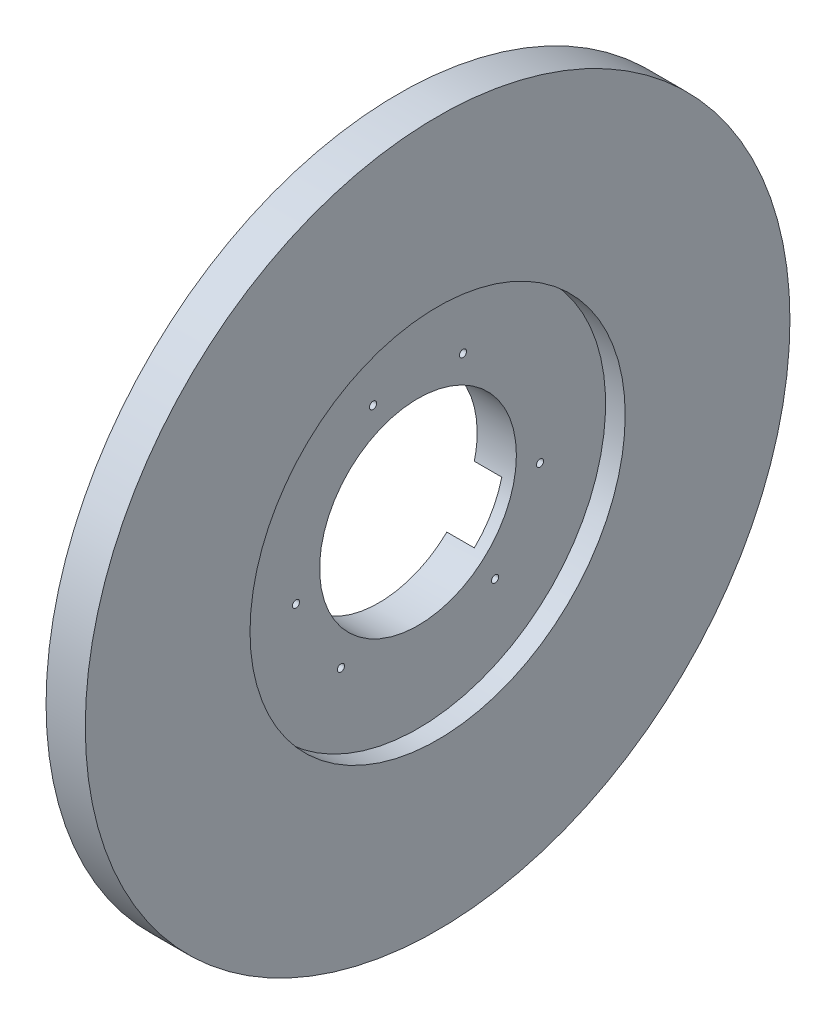
ISO-10303-21;
HEADER;
FILE_DESCRIPTION(('STEP AP214'),'2;1');
FILE_NAME('part.step','',(''),(''),'','','');
FILE_SCHEMA(('AUTOMOTIVE_DESIGN { 1 0 10303 214 1 1 1 1 }'));
ENDSEC;
DATA;
#1=APPLICATION_CONTEXT('core data for automotive mechanical design processes');
#2=APPLICATION_PROTOCOL_DEFINITION('international standard','automotive_design',2000,#1);
#3=PRODUCT_CONTEXT('',#1,'mechanical');
#4=PRODUCT('Part','Part','',(#3));
#5=PRODUCT_RELATED_PRODUCT_CATEGORY('part','',(#4));
#6=PRODUCT_DEFINITION_FORMATION('','',#4);
#7=PRODUCT_DEFINITION_CONTEXT('part definition',#1,'design');
#8=PRODUCT_DEFINITION('design','',#6,#7);
#9=PRODUCT_DEFINITION_SHAPE('','',#8);
#10=(LENGTH_UNIT() NAMED_UNIT(*) SI_UNIT(.MILLI.,.METRE.));
#11=(NAMED_UNIT(*) PLANE_ANGLE_UNIT() SI_UNIT($,.RADIAN.));
#12=(NAMED_UNIT(*) SI_UNIT($,.STERADIAN.) SOLID_ANGLE_UNIT());
#13=UNCERTAINTY_MEASURE_WITH_UNIT(LENGTH_MEASURE(1.E-05),#10,'distance_accuracy_value','');
#14=(GEOMETRIC_REPRESENTATION_CONTEXT(3) GLOBAL_UNCERTAINTY_ASSIGNED_CONTEXT((#13)) GLOBAL_UNIT_ASSIGNED_CONTEXT((#10,
#11,#12)) REPRESENTATION_CONTEXT('',''));
#15=CARTESIAN_POINT('',(0.,0.,0.));
#16=DIRECTION('',(0.,0.,1.));
#17=DIRECTION('',(1.,0.,0.));
#18=AXIS2_PLACEMENT_3D('',#15,#16,#17);
#19=CARTESIAN_POINT('',(-5.,0.,0.));
#20=DIRECTION('',(-1.,0.,0.));
#21=DIRECTION('',(0.,0.,1.));
#22=AXIS2_PLACEMENT_3D('',#19,#20,#21);
#23=PLANE('',#22);
#24=CARTESIAN_POINT('',(-5.,0.,0.));
#25=DIRECTION('',(1.,0.,0.));
#26=DIRECTION('',(0.,0.,-1.));
#27=AXIS2_PLACEMENT_3D('',#24,#25,#26);
#28=CIRCLE('',#27,25.085);
#29=CARTESIAN_POINT('',(-5.,-5.97828167242084,-24.3622119940944));
#30=VERTEX_POINT('',#29);
#31=CARTESIAN_POINT('',(-5.,24.0874353154781,-7.00376219775181));
#32=VERTEX_POINT('',#31);
#33=EDGE_CURVE('E238',#30,#32,#28,.T.);
#34=ORIENTED_EDGE('',*,*,#33,.T.);
#35=CARTESIAN_POINT('',(-5.,29.2826,0.));
#36=DIRECTION('',(1.,0.,0.));
#37=DIRECTION('',(0.,0.,1.));
#38=AXIS2_PLACEMENT_3D('',#35,#36,#37);
#39=CIRCLE('',#38,8.72023056013776);
#40=CARTESIAN_POINT('',(-5.,29.2826,-8.72023056013776));
#41=VERTEX_POINT('',#40);
#42=EDGE_CURVE('E61',#32,#41,#39,.T.);
#43=ORIENTED_EDGE('',*,*,#42,.T.);
#44=CARTESIAN_POINT('',(-5.,29.2826,-11.4641016151378));
#45=DIRECTION('',(-1.,0.,0.));
#46=DIRECTION('',(0.,0.,-1.));
#47=AXIS2_PLACEMENT_3D('',#44,#45,#46);
#48=CIRCLE('',#47,2.743871055);
#49=CARTESIAN_POINT('',(-5.,30.6545355275,-13.8403636534766));
#50=VERTEX_POINT('',#49);
#51=EDGE_CURVE('E170',#41,#50,#48,.T.);
#52=ORIENTED_EDGE('',*,*,#51,.T.);
#53=DIRECTION('',(0.,-0.866025403784439,-0.5));
#54=VECTOR('',#53,1.);
#55=CARTESIAN_POINT('',(-5.,-3.34116124222451,-33.4677883347659));
#56=LINE('',#55,#54);
#57=CARTESIAN_POINT('',(-5.,-3.34116124222451,-33.4677883347659));
#58=VERTEX_POINT('',#57);
#59=EDGE_CURVE('E259',#50,#58,#56,.T.);
#60=ORIENTED_EDGE('',*,*,#59,.T.);
#61=CARTESIAN_POINT('',(-5.,-4.71309676972448,-31.0915262964271));
#62=DIRECTION('',(-1.,0.,0.));
#63=DIRECTION('',(0.,0.,1.));
#64=AXIS2_PLACEMENT_3D('',#61,#62,#63);
#65=CIRCLE('',#64,2.74387105500001);
#66=CARTESIAN_POINT('',(-5.,-7.08935880806329,-29.7195907689271));
#67=VERTEX_POINT('',#66);
#68=EDGE_CURVE('E262',#58,#67,#65,.T.);
#69=ORIENTED_EDGE('',*,*,#68,.T.);
#70=CARTESIAN_POINT('',(-5.,-14.6413,-25.3594754888582));
#71=DIRECTION('',(1.,0.,0.));
#72=DIRECTION('',(0.,0.,1.));
#73=AXIS2_PLACEMENT_3D('',#70,#71,#72);
#74=CIRCLE('',#73,8.72023056013776);
#75=EDGE_CURVE('E266',#67,#30,#74,.T.);
#76=ORIENTED_EDGE('',*,*,#75,.T.);
#77=EDGE_LOOP('',(#34,#43,#52,#60,#69,#76));
#78=FACE_BOUND('',#77,.T.);
#79=CARTESIAN_POINT('',(-5.,-4.74524992630389,-31.1100899300334));
#80=DIRECTION('',(-1.,0.,0.));
#81=DIRECTION('',(0.,0.866025403784436,-0.500000000000004));
#82=AXIS2_PLACEMENT_3D('',#79,#80,#81);
#83=CIRCLE('',#82,0.914623685000006);
#84=CARTESIAN_POINT('',(-5.,-3.95316258019095,-31.5674017725334));
#85=VERTEX_POINT('',#84);
#86=EDGE_CURVE('E323',#85,#85,#83,.T.);
#87=ORIENTED_EDGE('',*,*,#86,.F.);
#88=EDGE_LOOP('',(#87));
#89=FACE_BOUND('',#88,.T.);
#90=CARTESIAN_POINT('',(-5.,29.2826,-11.4641016151378));
#91=DIRECTION('',(-1.,0.,0.));
#92=DIRECTION('',(0.,0.,-1.));
#93=AXIS2_PLACEMENT_3D('',#90,#91,#92);
#94=CIRCLE('',#93,0.914623685000006);
#95=CARTESIAN_POINT('',(-5.,29.2826,-12.3787253001378));
#96=VERTEX_POINT('',#95);
#97=EDGE_CURVE('E339',#96,#96,#94,.T.);
#98=ORIENTED_EDGE('',*,*,#97,.F.);
#99=EDGE_LOOP('',(#98));
#100=FACE_BOUND('',#99,.T.);
#101=ADVANCED_FACE('F40',(#78,#89,#100),#23,.T.);
#102=CARTESIAN_POINT('',(-5.,-18.1091536430573,17.3584497963426));
#103=VERTEX_POINT('',#102);
#104=CARTESIAN_POINT('',(-5.,-18.1091536430573,-17.3584497963426));
#105=VERTEX_POINT('',#104);
#106=EDGE_CURVE('E240',#103,#105,#28,.T.);
#107=ORIENTED_EDGE('',*,*,#106,.T.);
#108=CARTESIAN_POINT('',(-5.,-22.1932411919367,-20.9993602087893));
#109=VERTEX_POINT('',#108);
#110=EDGE_CURVE('E265',#105,#109,#74,.T.);
#111=ORIENTED_EDGE('',*,*,#110,.T.);
#112=CARTESIAN_POINT('',(-5.,-24.5695032302755,-19.6274246812893));
#113=DIRECTION('',(-1.,0.,0.));
#114=DIRECTION('',(0.,0.,1.));
#115=AXIS2_PLACEMENT_3D('',#112,#113,#114);
#116=CIRCLE('',#115,2.74387105499998);
#117=CARTESIAN_POINT('',(-5.,-27.3133742852755,-19.6274246812893));
#118=VERTEX_POINT('',#117);
#119=EDGE_CURVE('E269',#109,#118,#116,.T.);
#120=ORIENTED_EDGE('',*,*,#119,.T.);
#121=DIRECTION('',(0.,0.,1.));
#122=VECTOR('',#121,1.);
#123=CARTESIAN_POINT('',(-5.,-27.3133742852755,-19.6274246812893));
#124=LINE('',#123,#122);
#125=CARTESIAN_POINT('',(-5.,-27.3133742852755,19.6274246812893));
#126=VERTEX_POINT('',#125);
#127=EDGE_CURVE('E272',#118,#126,#124,.T.);
#128=ORIENTED_EDGE('',*,*,#127,.T.);
#129=CARTESIAN_POINT('',(-5.,-24.5695032302755,19.6274246812893));
#130=DIRECTION('',(-1.,0.,0.));
#131=DIRECTION('',(0.,0.,-1.));
#132=AXIS2_PLACEMENT_3D('',#129,#130,#131);
#133=CIRCLE('',#132,2.743871055);
#134=CARTESIAN_POINT('',(-5.,-22.1932411919367,20.9993602087893));
#135=VERTEX_POINT('',#134);
#136=EDGE_CURVE('E275',#126,#135,#133,.T.);
#137=ORIENTED_EDGE('',*,*,#136,.T.);
#138=CARTESIAN_POINT('',(-5.,-14.6413,25.3594754888582));
#139=DIRECTION('',(1.,0.,0.));
#140=DIRECTION('',(0.,0.,1.));
#141=AXIS2_PLACEMENT_3D('',#138,#139,#140);
#142=CIRCLE('',#141,8.72023056013776);
#143=EDGE_CURVE('E279',#135,#103,#142,.T.);
#144=ORIENTED_EDGE('',*,*,#143,.T.);
#145=EDGE_LOOP('',(#107,#111,#120,#128,#137,#144));
#146=FACE_BOUND('',#145,.T.);
#147=CARTESIAN_POINT('',(-5.,-24.6016563868546,19.6459883148959));
#148=DIRECTION('',(-1.,0.,0.));
#149=DIRECTION('',(0.,-0.866025403784443,-0.499999999999992));
#150=AXIS2_PLACEMENT_3D('',#147,#148,#149);
#151=CIRCLE('',#150,0.914623685000006);
#152=CARTESIAN_POINT('',(-5.,-25.3937437329675,19.1886764723959));
#153=VERTEX_POINT('',#152);
#154=EDGE_CURVE('E318',#153,#153,#151,.T.);
#155=ORIENTED_EDGE('',*,*,#154,.F.);
#156=EDGE_LOOP('',(#155));
#157=FACE_BOUND('',#156,.T.);
#158=CARTESIAN_POINT('',(-5.,-24.6016563868549,-19.6459883148955));
#159=DIRECTION('',(-1.,0.,0.));
#160=DIRECTION('',(0.,-0.866025403784436,0.500000000000004));
#161=AXIS2_PLACEMENT_3D('',#158,#159,#160);
#162=CIRCLE('',#161,0.914623685000006);
#163=CARTESIAN_POINT('',(-5.,-25.3937437329678,-19.1886764723955));
#164=VERTEX_POINT('',#163);
#165=EDGE_CURVE('E311',#164,#164,#162,.T.);
#166=ORIENTED_EDGE('',*,*,#165,.F.);
#167=EDGE_LOOP('',(#166));
#168=FACE_BOUND('',#167,.T.);
#169=ADVANCED_FACE('F377',(#146,#157,#168),#23,.T.);
#170=CARTESIAN_POINT('',(0.,-14.6413,25.3594754888582));
#171=DIRECTION('',(-1.,0.,0.));
#172=DIRECTION('',(0.,0.,1.));
#173=AXIS2_PLACEMENT_3D('',#170,#171,#172);
#174=CYLINDRICAL_SURFACE('',#173,8.72023056013776);
#175=DIRECTION('',(1.,0.,0.));
#176=VECTOR('',#175,1.);
#177=CARTESIAN_POINT('',(0.,-18.1091536430573,17.3584497963426));
#178=LINE('',#177,#176);
#179=CARTESIAN_POINT('',(2.,-18.1091536430573,17.3584497963426));
#180=VERTEX_POINT('',#179);
#181=EDGE_CURVE('E250',#103,#180,#178,.T.);
#182=ORIENTED_EDGE('',*,*,#181,.F.);
#183=ORIENTED_EDGE('',*,*,#143,.F.);
#184=DIRECTION('',(-1.,0.,0.));
#185=VECTOR('',#184,1.);
#186=CARTESIAN_POINT('',(0.,-22.1932411919367,20.9993602087893));
#187=LINE('',#186,#185);
#188=CARTESIAN_POINT('',(2.,-22.1932411919367,20.9993602087893));
#189=VERTEX_POINT('',#188);
#190=EDGE_CURVE('E296',#189,#135,#187,.T.);
#191=ORIENTED_EDGE('',*,*,#190,.F.);
#192=CARTESIAN_POINT('',(2.,-14.6413,25.3594754888582));
#193=DIRECTION('',(-1.,0.,0.));
#194=DIRECTION('',(0.,0.,1.));
#195=AXIS2_PLACEMENT_3D('',#192,#193,#194);
#196=CIRCLE('',#195,8.72023056013776);
#197=EDGE_CURVE('E210',#180,#189,#196,.T.);
#198=ORIENTED_EDGE('',*,*,#197,.F.);
#199=EDGE_LOOP('',(#182,#183,#191,#198));
#200=FACE_BOUND('',#199,.T.);
#201=ADVANCED_FACE('F409',(#200),#174,.F.);
#202=CARTESIAN_POINT('',(0.,-14.6413,-25.3594754888582));
#203=DIRECTION('',(-1.,0.,0.));
#204=DIRECTION('',(0.,0.,1.));
#205=AXIS2_PLACEMENT_3D('',#202,#203,#204);
#206=CYLINDRICAL_SURFACE('',#205,8.72023056013776);
#207=DIRECTION('',(1.,0.,0.));
#208=VECTOR('',#207,1.);
#209=CARTESIAN_POINT('',(0.,-5.97828167242085,-24.3622119940944));
#210=LINE('',#209,#208);
#211=CARTESIAN_POINT('',(2.,-5.97828167242085,-24.3622119940944));
#212=VERTEX_POINT('',#211);
#213=EDGE_CURVE('E246',#30,#212,#210,.T.);
#214=ORIENTED_EDGE('',*,*,#213,.F.);
#215=ORIENTED_EDGE('',*,*,#75,.F.);
#216=DIRECTION('',(-1.,0.,0.));
#217=VECTOR('',#216,1.);
#218=CARTESIAN_POINT('',(0.,-7.08935880806329,-29.7195907689271));
#219=LINE('',#218,#217);
#220=CARTESIAN_POINT('',(2.,-7.08935880806331,-29.7195907689271));
#221=VERTEX_POINT('',#220);
#222=EDGE_CURVE('E305',#221,#67,#219,.T.);
#223=ORIENTED_EDGE('',*,*,#222,.F.);
#224=CARTESIAN_POINT('',(2.,-14.6413,-25.3594754888582));
#225=DIRECTION('',(-1.,0.,0.));
#226=DIRECTION('',(0.,0.,1.));
#227=AXIS2_PLACEMENT_3D('',#224,#225,#226);
#228=CIRCLE('',#227,8.72023056013776);
#229=EDGE_CURVE('E228',#212,#221,#228,.T.);
#230=ORIENTED_EDGE('',*,*,#229,.F.);
#231=EDGE_LOOP('',(#214,#215,#223,#230));
#232=FACE_BOUND('',#231,.T.);
#233=ADVANCED_FACE('F365',(#232),#206,.F.);
#234=CARTESIAN_POINT('',(0.,29.2826,0.));
#235=DIRECTION('',(-1.,0.,0.));
#236=DIRECTION('',(0.,0.,1.));
#237=AXIS2_PLACEMENT_3D('',#234,#235,#236);
#238=CYLINDRICAL_SURFACE('',#237,8.72023056013776);
#239=DIRECTION('',(1.,0.,0.));
#240=VECTOR('',#239,1.);
#241=CARTESIAN_POINT('',(0.,24.0874353154781,7.00376219775181));
#242=LINE('',#241,#240);
#243=CARTESIAN_POINT('',(-5.,24.0874353154781,7.00376219775181));
#244=VERTEX_POINT('',#243);
#245=CARTESIAN_POINT('',(2.,24.0874353154781,7.00376219775181));
#246=VERTEX_POINT('',#245);
#247=EDGE_CURVE('E11',#244,#246,#242,.T.);
#248=ORIENTED_EDGE('',*,*,#247,.F.);
#249=CARTESIAN_POINT('',(-5.,29.2826,8.72023056013776));
#250=VERTEX_POINT('',#249);
#251=EDGE_CURVE('E255',#250,#244,#39,.T.);
#252=ORIENTED_EDGE('',*,*,#251,.F.);
#253=DIRECTION('',(-1.,0.,0.));
#254=VECTOR('',#253,1.);
#255=CARTESIAN_POINT('',(0.,29.2826,8.72023056013776));
#256=LINE('',#255,#254);
#257=CARTESIAN_POINT('',(2.,29.2826,8.72023056013775));
#258=VERTEX_POINT('',#257);
#259=EDGE_CURVE('E172',#258,#250,#256,.T.);
#260=ORIENTED_EDGE('',*,*,#259,.F.);
#261=CARTESIAN_POINT('',(2.,29.2826,0.));
#262=DIRECTION('',(-1.,0.,0.));
#263=DIRECTION('',(0.,0.,1.));
#264=AXIS2_PLACEMENT_3D('',#261,#262,#263);
#265=CIRCLE('',#264,8.72023056013776);
#266=EDGE_CURVE('E192',#246,#258,#265,.T.);
#267=ORIENTED_EDGE('',*,*,#266,.F.);
#268=EDGE_LOOP('',(#248,#252,#260,#267));
#269=FACE_BOUND('',#268,.T.);
#270=ADVANCED_FACE('F405',(#269),#238,.F.);
#271=CARTESIAN_POINT('',(10.,0.,0.));
#272=DIRECTION('',(-1.,0.,0.));
#273=DIRECTION('',(0.,0.,1.));
#274=AXIS2_PLACEMENT_3D('',#271,#272,#273);
#275=CYLINDRICAL_SURFACE('',#274,47.825);
#276=CARTESIAN_POINT('',(10.,0.,0.));
#277=DIRECTION('',(1.,0.,0.));
#278=DIRECTION('',(0.,0.,-1.));
#279=AXIS2_PLACEMENT_3D('',#276,#277,#278);
#280=CIRCLE('',#279,47.825);
#281=CARTESIAN_POINT('',(10.,0.,-47.825));
#282=VERTEX_POINT('',#281);
#283=EDGE_CURVE('E349',#282,#282,#280,.T.);
#284=ORIENTED_EDGE('',*,*,#283,.T.);
#285=EDGE_LOOP('',(#284));
#286=FACE_BOUND('',#285,.T.);
#287=CARTESIAN_POINT('',(5.,0.,0.));
#288=DIRECTION('',(-1.,0.,0.));
#289=DIRECTION('',(0.,0.,1.));
#290=AXIS2_PLACEMENT_3D('',#287,#288,#289);
#291=CIRCLE('',#290,47.825);
#292=CARTESIAN_POINT('',(5.,0.,47.825));
#293=VERTEX_POINT('',#292);
#294=EDGE_CURVE('E342',#293,#293,#291,.T.);
#295=ORIENTED_EDGE('',*,*,#294,.T.);
#296=EDGE_LOOP('',(#295));
#297=FACE_BOUND('',#296,.T.);
#298=ADVANCED_FACE('F456',(#286,#297),#275,.F.);
#299=CARTESIAN_POINT('',(10.,0.,0.));
#300=DIRECTION('',(1.,0.,0.));
#301=DIRECTION('',(0.,0.,-1.));
#302=AXIS2_PLACEMENT_3D('',#299,#300,#301);
#303=PLANE('',#302);
#304=CARTESIAN_POINT('',(10.,0.,0.));
#305=DIRECTION('',(1.,0.,0.));
#306=DIRECTION('',(0.,0.,-1.));
#307=AXIS2_PLACEMENT_3D('',#304,#305,#306);
#308=CIRCLE('',#307,89.825);
#309=CARTESIAN_POINT('',(10.,0.,-89.825));
#310=VERTEX_POINT('',#309);
#311=EDGE_CURVE('E353',#310,#310,#308,.T.);
#312=ORIENTED_EDGE('',*,*,#311,.T.);
#313=EDGE_LOOP('',(#312));
#314=FACE_BOUND('',#313,.T.);
#315=ORIENTED_EDGE('',*,*,#283,.F.);
#316=EDGE_LOOP('',(#315));
#317=FACE_BOUND('',#316,.T.);
#318=ADVANCED_FACE('F459',(#314,#317),#303,.T.);
#319=CARTESIAN_POINT('',(0.,0.,0.));
#320=DIRECTION('',(1.,0.,0.));
#321=DIRECTION('',(0.,0.,-1.));
#322=AXIS2_PLACEMENT_3D('',#319,#320,#321);
#323=PLANE('',#322);
#324=CARTESIAN_POINT('',(0.,0.,0.));
#325=DIRECTION('',(-1.,0.,0.));
#326=DIRECTION('',(0.,0.,1.));
#327=AXIS2_PLACEMENT_3D('',#324,#325,#326);
#328=CIRCLE('',#327,51.325);
#329=CARTESIAN_POINT('',(0.,0.,51.325));
#330=VERTEX_POINT('',#329);
#331=EDGE_CURVE('E186',#330,#330,#328,.T.);
#332=ORIENTED_EDGE('',*,*,#331,.F.);
#333=EDGE_LOOP('',(#332));
#334=FACE_BOUND('',#333,.T.);
#335=CARTESIAN_POINT('',(0.,0.,0.));
#336=DIRECTION('',(1.,0.,0.));
#337=DIRECTION('',(0.,0.,-1.));
#338=AXIS2_PLACEMENT_3D('',#335,#336,#337);
#339=CIRCLE('',#338,89.825);
#340=CARTESIAN_POINT('',(0.,0.,-89.825));
#341=VERTEX_POINT('',#340);
#342=EDGE_CURVE('E352',#341,#341,#339,.T.);
#343=ORIENTED_EDGE('',*,*,#342,.F.);
#344=EDGE_LOOP('',(#343));
#345=FACE_BOUND('',#344,.T.);
#346=ADVANCED_FACE('F451',(#334,#345),#323,.F.);
#347=CARTESIAN_POINT('',(10.,0.,0.));
#348=DIRECTION('',(-1.,0.,0.));
#349=DIRECTION('',(0.,0.,1.));
#350=AXIS2_PLACEMENT_3D('',#347,#348,#349);
#351=CYLINDRICAL_SURFACE('',#350,89.825);
#352=ORIENTED_EDGE('',*,*,#311,.F.);
#353=EDGE_LOOP('',(#352));
#354=FACE_BOUND('',#353,.T.);
#355=ORIENTED_EDGE('',*,*,#342,.T.);
#356=EDGE_LOOP('',(#355));
#357=FACE_BOUND('',#356,.T.);
#358=ADVANCED_FACE('F42',(#354,#357),#351,.T.);
#359=CARTESIAN_POINT('',(5.,0.,0.));
#360=DIRECTION('',(-1.,0.,0.));
#361=DIRECTION('',(0.,0.,1.));
#362=AXIS2_PLACEMENT_3D('',#359,#360,#361);
#363=PLANE('',#362);
#364=CARTESIAN_POINT('',(5.,0.,0.));
#365=DIRECTION('',(1.,0.,0.));
#366=DIRECTION('',(0.,0.,-1.));
#367=AXIS2_PLACEMENT_3D('',#364,#365,#366);
#368=CIRCLE('',#367,25.085);
#369=CARTESIAN_POINT('',(5.,0.,-25.085));
#370=VERTEX_POINT('',#369);
#371=EDGE_CURVE('E236',#370,#370,#368,.T.);
#372=ORIENTED_EDGE('',*,*,#371,.F.);
#373=EDGE_LOOP('',(#372));
#374=FACE_BOUND('',#373,.T.);
#375=CARTESIAN_POINT('',(5.,-24.6016563868549,-19.6459883148955));
#376=DIRECTION('',(-1.,0.,0.));
#377=DIRECTION('',(0.,0.866025403784436,-0.500000000000004));
#378=AXIS2_PLACEMENT_3D('',#375,#376,#377);
#379=CIRCLE('',#378,0.914623685000006);
#380=CARTESIAN_POINT('',(5.,-23.8095690407419,-20.1033001573955));
#381=VERTEX_POINT('',#380);
#382=EDGE_CURVE('E314',#381,#381,#379,.F.);
#383=ORIENTED_EDGE('',*,*,#382,.F.);
#384=EDGE_LOOP('',(#383));
#385=FACE_BOUND('',#384,.T.);
#386=CARTESIAN_POINT('',(5.,-4.74524992630345,31.1100899300334));
#387=DIRECTION('',(-1.,0.,0.));
#388=DIRECTION('',(0.,-0.866025403784443,-0.499999999999992));
#389=AXIS2_PLACEMENT_3D('',#386,#387,#388);
#390=CIRCLE('',#389,0.914623685000006);
#391=CARTESIAN_POINT('',(5.,-5.5373372724164,30.6527780875335));
#392=VERTEX_POINT('',#391);
#393=EDGE_CURVE('E315',#392,#392,#390,.F.);
#394=ORIENTED_EDGE('',*,*,#393,.F.);
#395=EDGE_LOOP('',(#394));
#396=FACE_BOUND('',#395,.T.);
#397=CARTESIAN_POINT('',(5.,-4.74524992630389,-31.1100899300334));
#398=DIRECTION('',(-1.,0.,0.));
#399=DIRECTION('',(0.,0.866025403784436,-0.500000000000004));
#400=AXIS2_PLACEMENT_3D('',#397,#398,#399);
#401=CIRCLE('',#400,0.914623685000006);
#402=CARTESIAN_POINT('',(5.,-3.95316258019095,-31.5674017725334));
#403=VERTEX_POINT('',#402);
#404=EDGE_CURVE('E326',#403,#403,#401,.F.);
#405=ORIENTED_EDGE('',*,*,#404,.F.);
#406=EDGE_LOOP('',(#405));
#407=FACE_BOUND('',#406,.T.);
#408=CARTESIAN_POINT('',(5.,-24.6016563868546,19.6459883148959));
#409=DIRECTION('',(-1.,0.,0.));
#410=DIRECTION('',(0.,-0.866025403784443,-0.499999999999992));
#411=AXIS2_PLACEMENT_3D('',#408,#409,#410);
#412=CIRCLE('',#411,0.914623685000006);
#413=CARTESIAN_POINT('',(5.,-25.3937437329675,19.1886764723959));
#414=VERTEX_POINT('',#413);
#415=EDGE_CURVE('E327',#414,#414,#412,.F.);
#416=ORIENTED_EDGE('',*,*,#415,.F.);
#417=EDGE_LOOP('',(#416));
#418=FACE_BOUND('',#417,.T.);
#419=CARTESIAN_POINT('',(5.,29.2826,11.4641016151378));
#420=DIRECTION('',(-1.,0.,0.));
#421=DIRECTION('',(0.,0.,1.));
#422=AXIS2_PLACEMENT_3D('',#419,#420,#421);
#423=CIRCLE('',#422,0.914623685000006);
#424=CARTESIAN_POINT('',(5.,29.2826,12.3787253001378));
#425=VERTEX_POINT('',#424);
#426=EDGE_CURVE('E338',#425,#425,#423,.F.);
#427=ORIENTED_EDGE('',*,*,#426,.F.);
#428=EDGE_LOOP('',(#427));
#429=FACE_BOUND('',#428,.T.);
#430=CARTESIAN_POINT('',(5.,29.2826,-11.4641016151378));
#431=DIRECTION('',(-1.,0.,0.));
#432=DIRECTION('',(0.,0.,1.));
#433=AXIS2_PLACEMENT_3D('',#430,#431,#432);
#434=CIRCLE('',#433,0.914623685000006);
#435=CARTESIAN_POINT('',(5.,29.2826,-10.5494779301377));
#436=VERTEX_POINT('',#435);
#437=EDGE_CURVE('E330',#436,#436,#434,.F.);
#438=ORIENTED_EDGE('',*,*,#437,.F.);
#439=EDGE_LOOP('',(#438));
#440=FACE_BOUND('',#439,.T.);
#441=ORIENTED_EDGE('',*,*,#294,.F.);
#442=EDGE_LOOP('',(#441));
#443=FACE_BOUND('',#442,.T.);
#444=ADVANCED_FACE('F439',(#374,#385,#396,#407,#418,#429,#440,#443),#363,.F.);
#445=CARTESIAN_POINT('',(-5.,-5.97828167242086,24.3622119940944));
#446=VERTEX_POINT('',#445);
#447=EDGE_CURVE('E241',#244,#446,#28,.T.);
#448=ORIENTED_EDGE('',*,*,#447,.T.);
#449=CARTESIAN_POINT('',(-5.,-7.08935880806329,29.7195907689271));
#450=VERTEX_POINT('',#449);
#451=EDGE_CURVE('E278',#446,#450,#142,.T.);
#452=ORIENTED_EDGE('',*,*,#451,.T.);
#453=CARTESIAN_POINT('',(-5.,-4.71309676972448,31.0915262964271));
#454=DIRECTION('',(-1.,0.,0.));
#455=DIRECTION('',(0.,0.,1.));
#456=AXIS2_PLACEMENT_3D('',#453,#454,#455);
#457=CIRCLE('',#456,2.743871055);
#458=CARTESIAN_POINT('',(-5.,-3.34116124222448,33.4677883347659));
#459=VERTEX_POINT('',#458);
#460=EDGE_CURVE('E282',#450,#459,#457,.T.);
#461=ORIENTED_EDGE('',*,*,#460,.T.);
#462=DIRECTION('',(0.,0.866025403784438,-0.5));
#463=VECTOR('',#462,1.);
#464=CARTESIAN_POINT('',(-5.,30.6545355275,13.8403636534766));
#465=LINE('',#464,#463);
#466=CARTESIAN_POINT('',(-5.,30.6545355275,13.8403636534766));
#467=VERTEX_POINT('',#466);
#468=EDGE_CURVE('E285',#459,#467,#465,.T.);
#469=ORIENTED_EDGE('',*,*,#468,.T.);
#470=CARTESIAN_POINT('',(-5.,29.2826,11.4641016151378));
#471=DIRECTION('',(-1.,0.,0.));
#472=DIRECTION('',(0.,0.,-1.));
#473=AXIS2_PLACEMENT_3D('',#470,#471,#472);
#474=CIRCLE('',#473,2.743871055);
#475=EDGE_CURVE('E252',#467,#250,#474,.T.);
#476=ORIENTED_EDGE('',*,*,#475,.T.);
#477=ORIENTED_EDGE('',*,*,#251,.T.);
#478=EDGE_LOOP('',(#448,#452,#461,#469,#476,#477));
#479=FACE_BOUND('',#478,.T.);
#480=CARTESIAN_POINT('',(-5.,-4.74524992630345,31.1100899300334));
#481=DIRECTION('',(-1.,0.,0.));
#482=DIRECTION('',(0.,0.866025403784443,0.499999999999992));
#483=AXIS2_PLACEMENT_3D('',#480,#481,#482);
#484=CIRCLE('',#483,0.914623685000006);
#485=CARTESIAN_POINT('',(-5.,-3.95316258019051,31.5674017725334));
#486=VERTEX_POINT('',#485);
#487=EDGE_CURVE('E290',#486,#486,#484,.T.);
#488=ORIENTED_EDGE('',*,*,#487,.F.);
#489=EDGE_LOOP('',(#488));
#490=FACE_BOUND('',#489,.T.);
#491=CARTESIAN_POINT('',(-5.,29.2826,11.4641016151378));
#492=DIRECTION('',(-1.,0.,0.));
#493=DIRECTION('',(0.,0.,1.));
#494=AXIS2_PLACEMENT_3D('',#491,#492,#493);
#495=CIRCLE('',#494,0.914623685000006);
#496=CARTESIAN_POINT('',(-5.,29.2826,12.3787253001378));
#497=VERTEX_POINT('',#496);
#498=EDGE_CURVE('E335',#497,#497,#495,.T.);
#499=ORIENTED_EDGE('',*,*,#498,.F.);
#500=EDGE_LOOP('',(#499));
#501=FACE_BOUND('',#500,.T.);
#502=ADVANCED_FACE('F384',(#479,#490,#501),#23,.T.);
#503=CARTESIAN_POINT('',(10.001,29.2826,-11.4641016151378));
#504=DIRECTION('',(-1.,0.,0.));
#505=DIRECTION('',(0.,0.,1.));
#506=AXIS2_PLACEMENT_3D('',#503,#504,#505);
#507=CYLINDRICAL_SURFACE('',#506,0.914623685000006);
#508=ORIENTED_EDGE('',*,*,#97,.T.);
#509=EDGE_LOOP('',(#508));
#510=FACE_BOUND('',#509,.T.);
#511=ORIENTED_EDGE('',*,*,#437,.T.);
#512=EDGE_LOOP('',(#511));
#513=FACE_BOUND('',#512,.T.);
#514=ADVANCED_FACE('F438',(#510,#513),#507,.F.);
#515=CARTESIAN_POINT('',(10.001,29.2826,11.4641016151378));
#516=DIRECTION('',(-1.,0.,0.));
#517=DIRECTION('',(0.,0.,1.));
#518=AXIS2_PLACEMENT_3D('',#515,#516,#517);
#519=CYLINDRICAL_SURFACE('',#518,0.914623685000006);
#520=ORIENTED_EDGE('',*,*,#498,.T.);
#521=EDGE_LOOP('',(#520));
#522=FACE_BOUND('',#521,.T.);
#523=ORIENTED_EDGE('',*,*,#426,.T.);
#524=EDGE_LOOP('',(#523));
#525=FACE_BOUND('',#524,.T.);
#526=ADVANCED_FACE('F445',(#522,#525),#519,.F.);
#527=CARTESIAN_POINT('',(10.001,-24.6016563868546,19.6459883148959));
#528=DIRECTION('',(-1.,0.,0.));
#529=DIRECTION('',(0.,-0.866025403784443,-0.499999999999992));
#530=AXIS2_PLACEMENT_3D('',#527,#528,#529);
#531=CYLINDRICAL_SURFACE('',#530,0.914623685000006);
#532=ORIENTED_EDGE('',*,*,#154,.T.);
#533=EDGE_LOOP('',(#532));
#534=FACE_BOUND('',#533,.T.);
#535=ORIENTED_EDGE('',*,*,#415,.T.);
#536=EDGE_LOOP('',(#535));
#537=FACE_BOUND('',#536,.T.);
#538=ADVANCED_FACE('F702',(#534,#537),#531,.F.);
#539=CARTESIAN_POINT('',(10.001,-4.74524992630389,-31.1100899300334));
#540=DIRECTION('',(-1.,0.,0.));
#541=DIRECTION('',(0.,0.866025403784436,-0.500000000000004));
#542=AXIS2_PLACEMENT_3D('',#539,#540,#541);
#543=CYLINDRICAL_SURFACE('',#542,0.914623685000006);
#544=ORIENTED_EDGE('',*,*,#86,.T.);
#545=EDGE_LOOP('',(#544));
#546=FACE_BOUND('',#545,.T.);
#547=ORIENTED_EDGE('',*,*,#404,.T.);
#548=EDGE_LOOP('',(#547));
#549=FACE_BOUND('',#548,.T.);
#550=ADVANCED_FACE('F689',(#546,#549),#543,.F.);
#551=CARTESIAN_POINT('',(10.001,-4.74524992630345,31.1100899300334));
#552=DIRECTION('',(-1.,0.,0.));
#553=DIRECTION('',(0.,-0.866025403784443,-0.499999999999992));
#554=AXIS2_PLACEMENT_3D('',#551,#552,#553);
#555=CYLINDRICAL_SURFACE('',#554,0.914623685000006);
#556=ORIENTED_EDGE('',*,*,#487,.T.);
#557=EDGE_LOOP('',(#556));
#558=FACE_BOUND('',#557,.T.);
#559=ORIENTED_EDGE('',*,*,#393,.T.);
#560=EDGE_LOOP('',(#559));
#561=FACE_BOUND('',#560,.T.);
#562=ADVANCED_FACE('F684',(#558,#561),#555,.F.);
#563=CARTESIAN_POINT('',(10.001,-24.6016563868549,-19.6459883148955));
#564=DIRECTION('',(-1.,0.,0.));
#565=DIRECTION('',(0.,0.866025403784436,-0.500000000000004));
#566=AXIS2_PLACEMENT_3D('',#563,#564,#565);
#567=CYLINDRICAL_SURFACE('',#566,0.914623685000006);
#568=ORIENTED_EDGE('',*,*,#165,.T.);
#569=EDGE_LOOP('',(#568));
#570=FACE_BOUND('',#569,.T.);
#571=ORIENTED_EDGE('',*,*,#382,.T.);
#572=EDGE_LOOP('',(#571));
#573=FACE_BOUND('',#572,.T.);
#574=ADVANCED_FACE('F679',(#570,#573),#567,.F.);
#575=CARTESIAN_POINT('',(0.,29.2826,11.4641016151378));
#576=DIRECTION('',(-1.,0.,0.));
#577=DIRECTION('',(0.,0.,1.));
#578=AXIS2_PLACEMENT_3D('',#575,#576,#577);
#579=CYLINDRICAL_SURFACE('',#578,2.743871055);
#580=ORIENTED_EDGE('',*,*,#475,.F.);
#581=DIRECTION('',(-1.,0.,0.));
#582=VECTOR('',#581,1.);
#583=CARTESIAN_POINT('',(0.,30.6545355275,13.8403636534766));
#584=LINE('',#583,#582);
#585=CARTESIAN_POINT('',(2.,30.6545355275,13.8403636534766));
#586=VERTEX_POINT('',#585);
#587=EDGE_CURVE('E288',#586,#467,#584,.T.);
#588=ORIENTED_EDGE('',*,*,#587,.F.);
#589=CARTESIAN_POINT('',(2.,29.2826,11.4641016151378));
#590=DIRECTION('',(-1.,0.,0.));
#591=DIRECTION('',(0.,0.,1.));
#592=AXIS2_PLACEMENT_3D('',#589,#590,#591);
#593=CIRCLE('',#592,2.743871055);
#594=EDGE_CURVE('E195',#258,#586,#593,.F.);
#595=ORIENTED_EDGE('',*,*,#594,.F.);
#596=ORIENTED_EDGE('',*,*,#259,.T.);
#597=EDGE_LOOP('',(#580,#588,#595,#596));
#598=FACE_BOUND('',#597,.T.);
#599=ADVANCED_FACE('F402',(#598),#579,.T.);
#600=CARTESIAN_POINT('',(0.,30.6545355275,13.8403636534766));
#601=DIRECTION('',(0.,0.5,0.866025403784438));
#602=DIRECTION('',(0.,-0.866025403784439,0.5));
#603=AXIS2_PLACEMENT_3D('',#600,#601,#602);
#604=PLANE('',#603);
#605=ORIENTED_EDGE('',*,*,#468,.F.);
#606=DIRECTION('',(-1.,0.,0.));
#607=VECTOR('',#606,1.);
#608=CARTESIAN_POINT('',(0.,-3.34116124222448,33.4677883347659));
#609=LINE('',#608,#607);
#610=CARTESIAN_POINT('',(2.,-3.34116124222448,33.4677883347659));
#611=VERTEX_POINT('',#610);
#612=EDGE_CURVE('E291',#611,#459,#609,.T.);
#613=ORIENTED_EDGE('',*,*,#612,.F.);
#614=DIRECTION('',(0.,-0.866025403784439,0.5));
#615=VECTOR('',#614,1.);
#616=CARTESIAN_POINT('',(2.,13.6566871426378,23.6540759941212));
#617=LINE('',#616,#615);
#618=EDGE_CURVE('E198',#586,#611,#617,.T.);
#619=ORIENTED_EDGE('',*,*,#618,.F.);
#620=ORIENTED_EDGE('',*,*,#587,.T.);
#621=EDGE_LOOP('',(#605,#613,#619,#620));
#622=FACE_BOUND('',#621,.T.);
#623=ADVANCED_FACE('F398',(#622),#604,.T.);
#624=CARTESIAN_POINT('',(0.,-4.71309676972448,31.0915262964271));
#625=DIRECTION('',(-1.,0.,0.));
#626=DIRECTION('',(0.,0.,1.));
#627=AXIS2_PLACEMENT_3D('',#624,#625,#626);
#628=CYLINDRICAL_SURFACE('',#627,2.743871055);
#629=ORIENTED_EDGE('',*,*,#460,.F.);
#630=DIRECTION('',(-1.,0.,0.));
#631=VECTOR('',#630,1.);
#632=CARTESIAN_POINT('',(0.,-7.08935880806329,29.7195907689271));
#633=LINE('',#632,#631);
#634=CARTESIAN_POINT('',(2.,-7.08935880806329,29.7195907689271));
#635=VERTEX_POINT('',#634);
#636=EDGE_CURVE('E293',#635,#450,#633,.T.);
#637=ORIENTED_EDGE('',*,*,#636,.F.);
#638=CARTESIAN_POINT('',(2.,-4.71309676972448,31.0915262964271));
#639=DIRECTION('',(-1.,0.,0.));
#640=DIRECTION('',(0.,0.,1.));
#641=AXIS2_PLACEMENT_3D('',#638,#639,#640);
#642=CIRCLE('',#641,2.743871055);
#643=EDGE_CURVE('E201',#611,#635,#642,.F.);
#644=ORIENTED_EDGE('',*,*,#643,.F.);
#645=ORIENTED_EDGE('',*,*,#612,.T.);
#646=EDGE_LOOP('',(#629,#637,#644,#645));
#647=FACE_BOUND('',#646,.T.);
#648=ADVANCED_FACE('F394',(#647),#628,.T.);
#649=DIRECTION('',(1.,0.,0.));
#650=VECTOR('',#649,1.);
#651=CARTESIAN_POINT('',(0.,-5.97828167242086,24.3622119940944));
#652=LINE('',#651,#650);
#653=CARTESIAN_POINT('',(2.,-5.97828167242085,24.3622119940944));
#654=VERTEX_POINT('',#653);
#655=EDGE_CURVE('E248',#654,#446,#652,.F.);
#656=ORIENTED_EDGE('',*,*,#655,.F.);
#657=CARTESIAN_POINT('',(2.,-14.6413,25.3594754888582));
#658=DIRECTION('',(-1.,0.,0.));
#659=DIRECTION('',(0.,0.,1.));
#660=AXIS2_PLACEMENT_3D('',#657,#658,#659);
#661=CIRCLE('',#660,8.72023056013776);
#662=EDGE_CURVE('E204',#635,#654,#661,.T.);
#663=ORIENTED_EDGE('',*,*,#662,.F.);
#664=ORIENTED_EDGE('',*,*,#636,.T.);
#665=ORIENTED_EDGE('',*,*,#451,.F.);
#666=EDGE_LOOP('',(#656,#663,#664,#665));
#667=FACE_BOUND('',#666,.T.);
#668=ADVANCED_FACE('F389',(#667),#174,.F.);
#669=CARTESIAN_POINT('',(0.,-24.5695032302755,19.6274246812893));
#670=DIRECTION('',(-1.,0.,0.));
#671=DIRECTION('',(0.,0.,1.));
#672=AXIS2_PLACEMENT_3D('',#669,#670,#671);
#673=CYLINDRICAL_SURFACE('',#672,2.743871055);
#674=ORIENTED_EDGE('',*,*,#136,.F.);
#675=DIRECTION('',(-1.,0.,0.));
#676=VECTOR('',#675,1.);
#677=CARTESIAN_POINT('',(0.,-27.3133742852755,19.6274246812893));
#678=LINE('',#677,#676);
#679=CARTESIAN_POINT('',(2.,-27.3133742852755,19.6274246812893));
#680=VERTEX_POINT('',#679);
#681=EDGE_CURVE('E298',#680,#126,#678,.T.);
#682=ORIENTED_EDGE('',*,*,#681,.F.);
#683=CARTESIAN_POINT('',(2.,-24.5695032302755,19.6274246812893));
#684=DIRECTION('',(-1.,0.,0.));
#685=DIRECTION('',(0.,0.,1.));
#686=AXIS2_PLACEMENT_3D('',#683,#684,#685);
#687=CIRCLE('',#686,2.743871055);
#688=EDGE_CURVE('E213',#189,#680,#687,.F.);
#689=ORIENTED_EDGE('',*,*,#688,.F.);
#690=ORIENTED_EDGE('',*,*,#190,.T.);
#691=EDGE_LOOP('',(#674,#682,#689,#690));
#692=FACE_BOUND('',#691,.T.);
#693=ADVANCED_FACE('F414',(#692),#673,.T.);
#694=CARTESIAN_POINT('',(0.,-27.3133742852755,-19.6274246812893));
#695=DIRECTION('',(0.,-1.,0.));
#696=DIRECTION('',(0.,0.,-1.));
#697=AXIS2_PLACEMENT_3D('',#694,#695,#696);
#698=PLANE('',#697);
#699=ORIENTED_EDGE('',*,*,#127,.F.);
#700=DIRECTION('',(-1.,0.,0.));
#701=VECTOR('',#700,1.);
#702=CARTESIAN_POINT('',(0.,-27.3133742852755,-19.6274246812893));
#703=LINE('',#702,#701);
#704=CARTESIAN_POINT('',(2.,-27.3133742852755,-19.6274246812893));
#705=VERTEX_POINT('',#704);
#706=EDGE_CURVE('E300',#705,#118,#703,.T.);
#707=ORIENTED_EDGE('',*,*,#706,.F.);
#708=DIRECTION('',(0.,0.,-1.));
#709=VECTOR('',#708,1.);
#710=CARTESIAN_POINT('',(2.,-27.3133742852755,0.));
#711=LINE('',#710,#709);
#712=EDGE_CURVE('E216',#680,#705,#711,.T.);
#713=ORIENTED_EDGE('',*,*,#712,.F.);
#714=ORIENTED_EDGE('',*,*,#681,.T.);
#715=EDGE_LOOP('',(#699,#707,#713,#714));
#716=FACE_BOUND('',#715,.T.);
#717=ADVANCED_FACE('F417',(#716),#698,.T.);
#718=CARTESIAN_POINT('',(0.,-24.5695032302755,-19.6274246812893));
#719=DIRECTION('',(-1.,0.,0.));
#720=DIRECTION('',(0.,0.,1.));
#721=AXIS2_PLACEMENT_3D('',#718,#719,#720);
#722=CYLINDRICAL_SURFACE('',#721,2.74387105499998);
#723=ORIENTED_EDGE('',*,*,#119,.F.);
#724=DIRECTION('',(-1.,0.,0.));
#725=VECTOR('',#724,1.);
#726=CARTESIAN_POINT('',(0.,-22.1932411919367,-20.9993602087893));
#727=LINE('',#726,#725);
#728=CARTESIAN_POINT('',(2.,-22.1932411919367,-20.9993602087893));
#729=VERTEX_POINT('',#728);
#730=EDGE_CURVE('E302',#729,#109,#727,.T.);
#731=ORIENTED_EDGE('',*,*,#730,.F.);
#732=CARTESIAN_POINT('',(2.,-24.5695032302755,-19.6274246812893));
#733=DIRECTION('',(-1.,0.,0.));
#734=DIRECTION('',(0.,0.,1.));
#735=AXIS2_PLACEMENT_3D('',#732,#733,#734);
#736=CIRCLE('',#735,2.74387105499998);
#737=EDGE_CURVE('E219',#705,#729,#736,.F.);
#738=ORIENTED_EDGE('',*,*,#737,.F.);
#739=ORIENTED_EDGE('',*,*,#706,.T.);
#740=EDGE_LOOP('',(#723,#731,#738,#739));
#741=FACE_BOUND('',#740,.T.);
#742=ADVANCED_FACE('F419',(#741),#722,.T.);
#743=DIRECTION('',(1.,0.,0.));
#744=VECTOR('',#743,1.);
#745=CARTESIAN_POINT('',(0.,-18.1091536430573,-17.3584497963426));
#746=LINE('',#745,#744);
#747=CARTESIAN_POINT('',(2.,-18.1091536430573,-17.3584497963426));
#748=VERTEX_POINT('',#747);
#749=EDGE_CURVE('E244',#748,#105,#746,.F.);
#750=ORIENTED_EDGE('',*,*,#749,.F.);
#751=CARTESIAN_POINT('',(2.,-14.6413,-25.3594754888582));
#752=DIRECTION('',(-1.,0.,0.));
#753=DIRECTION('',(0.,0.,1.));
#754=AXIS2_PLACEMENT_3D('',#751,#752,#753);
#755=CIRCLE('',#754,8.72023056013776);
#756=EDGE_CURVE('E222',#729,#748,#755,.T.);
#757=ORIENTED_EDGE('',*,*,#756,.F.);
#758=ORIENTED_EDGE('',*,*,#730,.T.);
#759=ORIENTED_EDGE('',*,*,#110,.F.);
#760=EDGE_LOOP('',(#750,#757,#758,#759));
#761=FACE_BOUND('',#760,.T.);
#762=ADVANCED_FACE('F373',(#761),#206,.F.);
#763=CARTESIAN_POINT('',(0.,-4.71309676972448,-31.0915262964271));
#764=DIRECTION('',(-1.,0.,0.));
#765=DIRECTION('',(0.,0.,1.));
#766=AXIS2_PLACEMENT_3D('',#763,#764,#765);
#767=CYLINDRICAL_SURFACE('',#766,2.74387105500001);
#768=ORIENTED_EDGE('',*,*,#68,.F.);
#769=DIRECTION('',(-1.,0.,0.));
#770=VECTOR('',#769,1.);
#771=CARTESIAN_POINT('',(0.,-3.34116124222451,-33.4677883347659));
#772=LINE('',#771,#770);
#773=CARTESIAN_POINT('',(2.,-3.34116124222451,-33.4677883347659));
#774=VERTEX_POINT('',#773);
#775=EDGE_CURVE('E307',#774,#58,#772,.T.);
#776=ORIENTED_EDGE('',*,*,#775,.F.);
#777=CARTESIAN_POINT('',(2.,-4.71309676972448,-31.0915262964271));
#778=DIRECTION('',(-1.,0.,0.));
#779=DIRECTION('',(0.,0.,1.));
#780=AXIS2_PLACEMENT_3D('',#777,#778,#779);
#781=CIRCLE('',#780,2.74387105500001);
#782=EDGE_CURVE('E231',#221,#774,#781,.F.);
#783=ORIENTED_EDGE('',*,*,#782,.F.);
#784=ORIENTED_EDGE('',*,*,#222,.T.);
#785=EDGE_LOOP('',(#768,#776,#783,#784));
#786=FACE_BOUND('',#785,.T.);
#787=ADVANCED_FACE('F426',(#786),#767,.T.);
#788=CARTESIAN_POINT('',(0.,-3.34116124222451,-33.4677883347659));
#789=DIRECTION('',(0.,0.5,-0.866025403784439));
#790=DIRECTION('',(0.,0.866025403784439,0.5));
#791=AXIS2_PLACEMENT_3D('',#788,#789,#790);
#792=PLANE('',#791);
#793=ORIENTED_EDGE('',*,*,#59,.F.);
#794=DIRECTION('',(-1.,0.,0.));
#795=VECTOR('',#794,1.);
#796=CARTESIAN_POINT('',(0.,30.6545355275,-13.8403636534766));
#797=LINE('',#796,#795);
#798=CARTESIAN_POINT('',(2.,30.6545355275,-13.8403636534766));
#799=VERTEX_POINT('',#798);
#800=EDGE_CURVE('E171',#799,#50,#797,.T.);
#801=ORIENTED_EDGE('',*,*,#800,.F.);
#802=DIRECTION('',(0.,0.866025403784439,0.5));
#803=VECTOR('',#802,1.);
#804=CARTESIAN_POINT('',(2.,13.6566871426377,-23.6540759941212));
#805=LINE('',#804,#803);
#806=EDGE_CURVE('E185',#774,#799,#805,.T.);
#807=ORIENTED_EDGE('',*,*,#806,.F.);
#808=ORIENTED_EDGE('',*,*,#775,.T.);
#809=EDGE_LOOP('',(#793,#801,#807,#808));
#810=FACE_BOUND('',#809,.T.);
#811=ADVANCED_FACE('F534',(#810),#792,.T.);
#812=CARTESIAN_POINT('',(0.,29.2826,-11.4641016151378));
#813=DIRECTION('',(-1.,0.,0.));
#814=DIRECTION('',(0.,0.,1.));
#815=AXIS2_PLACEMENT_3D('',#812,#813,#814);
#816=CYLINDRICAL_SURFACE('',#815,2.743871055);
#817=ORIENTED_EDGE('',*,*,#51,.F.);
#818=DIRECTION('',(-1.,0.,0.));
#819=VECTOR('',#818,1.);
#820=CARTESIAN_POINT('',(0.,29.2826,-8.72023056013776));
#821=LINE('',#820,#819);
#822=CARTESIAN_POINT('',(2.,29.2826,-8.72023056013776));
#823=VERTEX_POINT('',#822);
#824=EDGE_CURVE('E165',#823,#41,#821,.T.);
#825=ORIENTED_EDGE('',*,*,#824,.F.);
#826=CARTESIAN_POINT('',(2.,29.2826,-11.4641016151378));
#827=DIRECTION('',(-1.,0.,0.));
#828=DIRECTION('',(0.,0.,1.));
#829=AXIS2_PLACEMENT_3D('',#826,#827,#828);
#830=CIRCLE('',#829,2.743871055);
#831=EDGE_CURVE('E168',#799,#823,#830,.F.);
#832=ORIENTED_EDGE('',*,*,#831,.F.);
#833=ORIENTED_EDGE('',*,*,#800,.T.);
#834=EDGE_LOOP('',(#817,#825,#832,#833));
#835=FACE_BOUND('',#834,.T.);
#836=ADVANCED_FACE('F166',(#835),#816,.T.);
#837=DIRECTION('',(1.,0.,0.));
#838=VECTOR('',#837,1.);
#839=CARTESIAN_POINT('',(0.,24.0874353154781,-7.00376219775181));
#840=LINE('',#839,#838);
#841=CARTESIAN_POINT('',(2.,24.0874353154781,-7.00376219775181));
#842=VERTEX_POINT('',#841);
#843=EDGE_CURVE('E48',#842,#32,#840,.F.);
#844=ORIENTED_EDGE('',*,*,#843,.F.);
#845=CARTESIAN_POINT('',(2.,29.2826,0.));
#846=DIRECTION('',(-1.,0.,0.));
#847=DIRECTION('',(0.,0.,1.));
#848=AXIS2_PLACEMENT_3D('',#845,#846,#847);
#849=CIRCLE('',#848,8.72023056013776);
#850=EDGE_CURVE('E174',#823,#842,#849,.T.);
#851=ORIENTED_EDGE('',*,*,#850,.F.);
#852=ORIENTED_EDGE('',*,*,#824,.T.);
#853=ORIENTED_EDGE('',*,*,#42,.F.);
#854=EDGE_LOOP('',(#844,#851,#852,#853));
#855=FACE_BOUND('',#854,.T.);
#856=ADVANCED_FACE('F175',(#855),#238,.F.);
#857=CARTESIAN_POINT('',(-5.,0.,0.));
#858=DIRECTION('',(1.,0.,0.));
#859=DIRECTION('',(0.,0.,-1.));
#860=AXIS2_PLACEMENT_3D('',#857,#858,#859);
#861=CYLINDRICAL_SURFACE('',#860,25.085);
#862=ORIENTED_EDGE('',*,*,#181,.T.);
#863=CARTESIAN_POINT('',(2.,0.,0.));
#864=DIRECTION('',(-1.,0.,0.));
#865=DIRECTION('',(0.,0.,1.));
#866=AXIS2_PLACEMENT_3D('',#863,#864,#865);
#867=CIRCLE('',#866,25.085);
#868=EDGE_CURVE('E207',#654,#180,#867,.F.);
#869=ORIENTED_EDGE('',*,*,#868,.F.);
#870=ORIENTED_EDGE('',*,*,#655,.T.);
#871=ORIENTED_EDGE('',*,*,#447,.F.);
#872=ORIENTED_EDGE('',*,*,#247,.T.);
#873=CARTESIAN_POINT('',(2.,0.,0.));
#874=DIRECTION('',(-1.,0.,0.));
#875=DIRECTION('',(0.,0.,1.));
#876=AXIS2_PLACEMENT_3D('',#873,#874,#875);
#877=CIRCLE('',#876,25.085);
#878=EDGE_CURVE('E179',#842,#246,#877,.F.);
#879=ORIENTED_EDGE('',*,*,#878,.F.);
#880=ORIENTED_EDGE('',*,*,#843,.T.);
#881=ORIENTED_EDGE('',*,*,#33,.F.);
#882=ORIENTED_EDGE('',*,*,#213,.T.);
#883=CARTESIAN_POINT('',(2.,0.,0.));
#884=DIRECTION('',(-1.,0.,0.));
#885=DIRECTION('',(0.,0.,1.));
#886=AXIS2_PLACEMENT_3D('',#883,#884,#885);
#887=CIRCLE('',#886,25.085);
#888=EDGE_CURVE('E225',#748,#212,#887,.F.);
#889=ORIENTED_EDGE('',*,*,#888,.F.);
#890=ORIENTED_EDGE('',*,*,#749,.T.);
#891=ORIENTED_EDGE('',*,*,#106,.F.);
#892=EDGE_LOOP('',(#862,#869,#870,#871,#872,#879,#880,#881,#882,#889,#890,#891));
#893=FACE_BOUND('',#892,.T.);
#894=ORIENTED_EDGE('',*,*,#371,.T.);
#895=EDGE_LOOP('',(#894));
#896=FACE_BOUND('',#895,.T.);
#897=ADVANCED_FACE('F358',(#893,#896),#861,.F.);
#898=CARTESIAN_POINT('',(2.,0.,0.));
#899=DIRECTION('',(-1.,0.,0.));
#900=DIRECTION('',(0.,0.,1.));
#901=AXIS2_PLACEMENT_3D('',#898,#899,#900);
#902=CYLINDRICAL_SURFACE('',#901,51.325);
#903=CARTESIAN_POINT('',(2.,0.,0.));
#904=DIRECTION('',(-1.,0.,0.));
#905=DIRECTION('',(0.,0.,1.));
#906=AXIS2_PLACEMENT_3D('',#903,#904,#905);
#907=CIRCLE('',#906,51.325);
#908=CARTESIAN_POINT('',(2.,0.,51.325));
#909=VERTEX_POINT('',#908);
#910=EDGE_CURVE('E234',#909,#909,#907,.T.);
#911=ORIENTED_EDGE('',*,*,#910,.F.);
#912=EDGE_LOOP('',(#911));
#913=FACE_BOUND('',#912,.T.);
#914=ORIENTED_EDGE('',*,*,#331,.T.);
#915=EDGE_LOOP('',(#914));
#916=FACE_BOUND('',#915,.T.);
#917=ADVANCED_FACE('F474',(#913,#916),#902,.F.);
#918=CARTESIAN_POINT('',(2.,0.,0.));
#919=DIRECTION('',(-1.,0.,0.));
#920=DIRECTION('',(0.,0.,1.));
#921=AXIS2_PLACEMENT_3D('',#918,#919,#920);
#922=PLANE('',#921);
#923=ORIENTED_EDGE('',*,*,#831,.T.);
#924=ORIENTED_EDGE('',*,*,#850,.T.);
#925=ORIENTED_EDGE('',*,*,#878,.T.);
#926=ORIENTED_EDGE('',*,*,#266,.T.);
#927=ORIENTED_EDGE('',*,*,#594,.T.);
#928=ORIENTED_EDGE('',*,*,#618,.T.);
#929=ORIENTED_EDGE('',*,*,#643,.T.);
#930=ORIENTED_EDGE('',*,*,#662,.T.);
#931=ORIENTED_EDGE('',*,*,#868,.T.);
#932=ORIENTED_EDGE('',*,*,#197,.T.);
#933=ORIENTED_EDGE('',*,*,#688,.T.);
#934=ORIENTED_EDGE('',*,*,#712,.T.);
#935=ORIENTED_EDGE('',*,*,#737,.T.);
#936=ORIENTED_EDGE('',*,*,#756,.T.);
#937=ORIENTED_EDGE('',*,*,#888,.T.);
#938=ORIENTED_EDGE('',*,*,#229,.T.);
#939=ORIENTED_EDGE('',*,*,#782,.T.);
#940=ORIENTED_EDGE('',*,*,#806,.T.);
#941=EDGE_LOOP('',(#923,#924,#925,#926,#927,#928,#929,#930,#931,#932,#933,#934,#935,#936,#937,
#938,#939,#940));
#942=FACE_BOUND('',#941,.T.);
#943=ORIENTED_EDGE('',*,*,#910,.T.);
#944=EDGE_LOOP('',(#943));
#945=FACE_BOUND('',#944,.T.);
#946=ADVANCED_FACE('F181',(#942,#945),#922,.T.);
#947=CLOSED_SHELL('',(#101,#169,#201,#233,#270,#298,#318,#346,#358,#444,#502,#514,#526,#538,
#550,#562,#574,#599,#623,#648,#668,#693,#717,#742,#762,#787,#811,#836,#856,#897,#917,#946));
#948=MANIFOLD_SOLID_BREP('B2',#947);
#949=ADVANCED_BREP_SHAPE_REPRESENTATION('',(#18,#948),#14);
#950=SHAPE_DEFINITION_REPRESENTATION(#9,#949);
ENDSEC;
END-ISO-10303-21;
